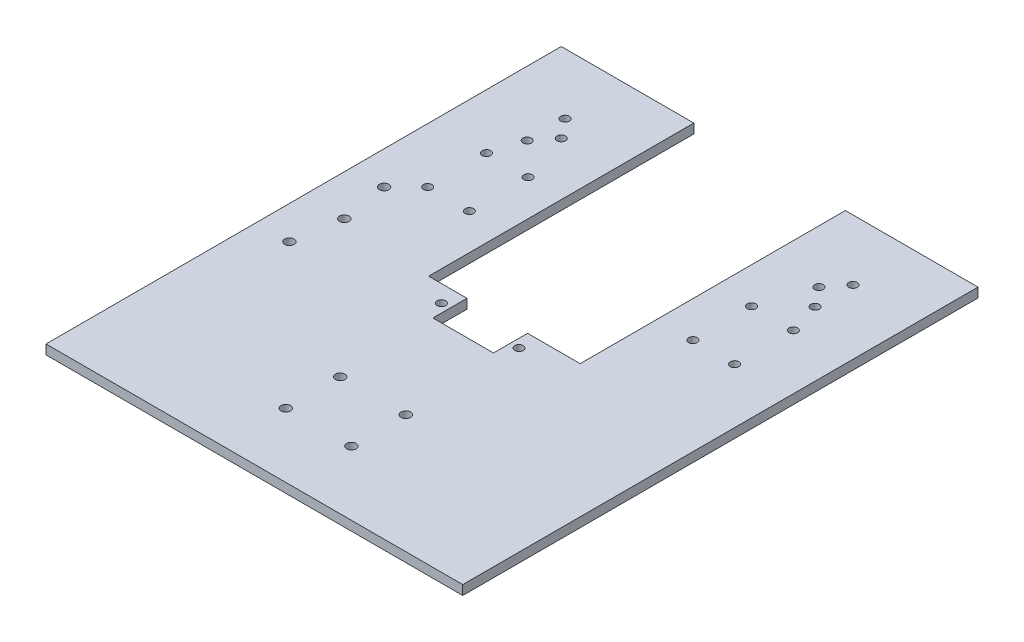
ISO-10303-21;
HEADER;
FILE_DESCRIPTION(('STEP AP214'),'2;1');
FILE_NAME('part.step','',(''),(''),'','','');
FILE_SCHEMA(('AUTOMOTIVE_DESIGN { 1 0 10303 214 1 1 1 1 }'));
ENDSEC;
DATA;
#1=APPLICATION_CONTEXT('core data for automotive mechanical design processes');
#2=APPLICATION_PROTOCOL_DEFINITION('international standard','automotive_design',2000,#1);
#3=PRODUCT_CONTEXT('',#1,'mechanical');
#4=PRODUCT('Part','Part','',(#3));
#5=PRODUCT_RELATED_PRODUCT_CATEGORY('part','',(#4));
#6=PRODUCT_DEFINITION_FORMATION('','',#4);
#7=PRODUCT_DEFINITION_CONTEXT('part definition',#1,'design');
#8=PRODUCT_DEFINITION('design','',#6,#7);
#9=PRODUCT_DEFINITION_SHAPE('','',#8);
#10=(LENGTH_UNIT() NAMED_UNIT(*) SI_UNIT(.MILLI.,.METRE.));
#11=(NAMED_UNIT(*) PLANE_ANGLE_UNIT() SI_UNIT($,.RADIAN.));
#12=(NAMED_UNIT(*) SI_UNIT($,.STERADIAN.) SOLID_ANGLE_UNIT());
#13=UNCERTAINTY_MEASURE_WITH_UNIT(LENGTH_MEASURE(1.E-05),#10,'distance_accuracy_value','');
#14=(GEOMETRIC_REPRESENTATION_CONTEXT(3) GLOBAL_UNCERTAINTY_ASSIGNED_CONTEXT((#13)) GLOBAL_UNIT_ASSIGNED_CONTEXT((#10,
#11,#12)) REPRESENTATION_CONTEXT('',''));
#15=CARTESIAN_POINT('',(0.,0.,0.));
#16=DIRECTION('',(0.,0.,1.));
#17=DIRECTION('',(1.,0.,0.));
#18=AXIS2_PLACEMENT_3D('',#15,#16,#17);
#19=CARTESIAN_POINT('',(0.,5.,0.));
#20=DIRECTION('',(0.,1.,0.));
#21=DIRECTION('',(0.,0.,1.));
#22=AXIS2_PLACEMENT_3D('',#19,#20,#21);
#23=PLANE('',#22);
#24=CARTESIAN_POINT('',(-92.4999999999999,5.,-25.));
#25=DIRECTION('',(0.,1.,0.));
#26=DIRECTION('',(0.,0.,1.));
#27=AXIS2_PLACEMENT_3D('',#24,#25,#26);
#28=CIRCLE('',#27,2.50000000000001);
#29=CARTESIAN_POINT('',(-92.4999999999999,5.,-22.5));
#30=VERTEX_POINT('',#29);
#31=EDGE_CURVE('E218',#30,#30,#28,.T.);
#32=ORIENTED_EDGE('',*,*,#31,.F.);
#33=EDGE_LOOP('',(#32));
#34=FACE_BOUND('',#33,.T.);
#35=CARTESIAN_POINT('',(-17.3151381179272,5.,73.3688551246659));
#36=DIRECTION('',(0.,1.,0.));
#37=DIRECTION('',(0.,0.,1.));
#38=AXIS2_PLACEMENT_3D('',#35,#36,#37);
#39=CIRCLE('',#38,2.5);
#40=CARTESIAN_POINT('',(-17.3151381179272,5.,75.8688551246659));
#41=VERTEX_POINT('',#40);
#42=EDGE_CURVE('E230',#41,#41,#39,.T.);
#43=ORIENTED_EDGE('',*,*,#42,.F.);
#44=EDGE_LOOP('',(#43));
#45=FACE_BOUND('',#44,.T.);
#46=CARTESIAN_POINT('',(17.3151381179272,5.,102.104616256545));
#47=DIRECTION('',(0.,1.,0.));
#48=DIRECTION('',(0.,0.,1.));
#49=AXIS2_PLACEMENT_3D('',#46,#47,#48);
#50=CIRCLE('',#49,2.5);
#51=CARTESIAN_POINT('',(17.3151381179272,5.,104.604616256545));
#52=VERTEX_POINT('',#51);
#53=EDGE_CURVE('E242',#52,#52,#50,.T.);
#54=ORIENTED_EDGE('',*,*,#53,.F.);
#55=EDGE_LOOP('',(#54));
#56=FACE_BOUND('',#55,.T.);
#57=CARTESIAN_POINT('',(-24.2696197225693,5.,13.));
#58=DIRECTION('',(0.,1.,0.));
#59=DIRECTION('',(0.,0.,1.));
#60=AXIS2_PLACEMENT_3D('',#57,#58,#59);
#61=CIRCLE('',#60,2.25000000000001);
#62=CARTESIAN_POINT('',(-24.2696197225693,5.,15.25));
#63=VERTEX_POINT('',#62);
#64=EDGE_CURVE('E275',#63,#63,#61,.T.);
#65=ORIENTED_EDGE('',*,*,#64,.F.);
#66=EDGE_LOOP('',(#65));
#67=FACE_BOUND('',#66,.T.);
#68=CARTESIAN_POINT('',(81.,5.,-67.5));
#69=DIRECTION('',(0.,1.,0.));
#70=DIRECTION('',(0.,0.,1.));
#71=AXIS2_PLACEMENT_3D('',#68,#69,#70);
#72=CIRCLE('',#71,2.25000000000001);
#73=CARTESIAN_POINT('',(81.,5.,-65.25));
#74=VERTEX_POINT('',#73);
#75=EDGE_CURVE('E287',#74,#74,#72,.T.);
#76=ORIENTED_EDGE('',*,*,#75,.F.);
#77=EDGE_LOOP('',(#76));
#78=FACE_BOUND('',#77,.T.);
#79=CARTESIAN_POINT('',(59.,5.,-36.5));
#80=DIRECTION('',(0.,1.,0.));
#81=DIRECTION('',(0.,0.,1.));
#82=AXIS2_PLACEMENT_3D('',#79,#80,#81);
#83=CIRCLE('',#82,2.25);
#84=CARTESIAN_POINT('',(59.,5.,-34.25));
#85=VERTEX_POINT('',#84);
#86=EDGE_CURVE('E299',#85,#85,#83,.T.);
#87=ORIENTED_EDGE('',*,*,#86,.F.);
#88=EDGE_LOOP('',(#87));
#89=FACE_BOUND('',#88,.T.);
#90=CARTESIAN_POINT('',(-59.,5.,-67.5));
#91=DIRECTION('',(0.,1.,0.));
#92=DIRECTION('',(0.,0.,1.));
#93=AXIS2_PLACEMENT_3D('',#90,#91,#92);
#94=CIRCLE('',#93,2.25);
#95=CARTESIAN_POINT('',(-59.,5.,-65.25));
#96=VERTEX_POINT('',#95);
#97=EDGE_CURVE('E311',#96,#96,#94,.T.);
#98=ORIENTED_EDGE('',*,*,#97,.F.);
#99=EDGE_LOOP('',(#98));
#100=FACE_BOUND('',#99,.T.);
#101=CARTESIAN_POINT('',(-81.,5.,-67.5));
#102=DIRECTION('',(0.,1.,0.));
#103=DIRECTION('',(0.,0.,1.));
#104=AXIS2_PLACEMENT_3D('',#101,#102,#103);
#105=CIRCLE('',#104,2.25000000000001);
#106=CARTESIAN_POINT('',(-81.,5.,-65.25));
#107=VERTEX_POINT('',#106);
#108=EDGE_CURVE('E323',#107,#107,#105,.T.);
#109=ORIENTED_EDGE('',*,*,#108,.F.);
#110=EDGE_LOOP('',(#109));
#111=FACE_BOUND('',#110,.T.);
#112=CARTESIAN_POINT('',(-76.,5.,-104.));
#113=DIRECTION('',(0.,1.,0.));
#114=DIRECTION('',(0.,0.,1.));
#115=AXIS2_PLACEMENT_3D('',#112,#113,#114);
#116=CIRCLE('',#115,2.25);
#117=CARTESIAN_POINT('',(-76.,5.,-101.75));
#118=VERTEX_POINT('',#117);
#119=EDGE_CURVE('E335',#118,#118,#116,.T.);
#120=ORIENTED_EDGE('',*,*,#119,.F.);
#121=EDGE_LOOP('',(#120));
#122=FACE_BOUND('',#121,.T.);
#123=CARTESIAN_POINT('',(-68.,5.,-94.));
#124=DIRECTION('',(0.,1.,0.));
#125=DIRECTION('',(0.,0.,1.));
#126=AXIS2_PLACEMENT_3D('',#123,#124,#125);
#127=CIRCLE('',#126,2.25000000000001);
#128=CARTESIAN_POINT('',(-68.,5.,-91.75));
#129=VERTEX_POINT('',#128);
#130=EDGE_CURVE('E347',#129,#129,#127,.T.);
#131=ORIENTED_EDGE('',*,*,#130,.F.);
#132=EDGE_LOOP('',(#131));
#133=FACE_BOUND('',#132,.T.);
#134=CARTESIAN_POINT('',(75.9999999999999,5.,-104.));
#135=DIRECTION('',(0.,1.,0.));
#136=DIRECTION('',(0.,0.,1.));
#137=AXIS2_PLACEMENT_3D('',#134,#135,#136);
#138=CIRCLE('',#137,2.23499999999999);
#139=CARTESIAN_POINT('',(75.9999999999999,5.,-101.765));
#140=VERTEX_POINT('',#139);
#141=EDGE_CURVE('E359',#140,#140,#138,.T.);
#142=ORIENTED_EDGE('',*,*,#141,.F.);
#143=EDGE_LOOP('',(#142));
#144=FACE_BOUND('',#143,.T.);
#145=CARTESIAN_POINT('',(67.9999999999999,5.,-94.));
#146=DIRECTION('',(0.,1.,0.));
#147=DIRECTION('',(0.,0.,1.));
#148=AXIS2_PLACEMENT_3D('',#145,#146,#147);
#149=CIRCLE('',#148,2.25);
#150=CARTESIAN_POINT('',(67.9999999999999,5.,-91.75));
#151=VERTEX_POINT('',#150);
#152=EDGE_CURVE('E363',#151,#151,#149,.T.);
#153=ORIENTED_EDGE('',*,*,#152,.F.);
#154=EDGE_LOOP('',(#153));
#155=FACE_BOUND('',#154,.T.);
#156=CARTESIAN_POINT('',(75.9999999999999,5.,-84.));
#157=DIRECTION('',(0.,1.,0.));
#158=DIRECTION('',(0.,0.,1.));
#159=AXIS2_PLACEMENT_3D('',#156,#157,#158);
#160=CIRCLE('',#159,2.24);
#161=CARTESIAN_POINT('',(75.9999999999999,5.,-81.76));
#162=VERTEX_POINT('',#161);
#163=EDGE_CURVE('E353',#162,#162,#160,.T.);
#164=ORIENTED_EDGE('',*,*,#163,.F.);
#165=EDGE_LOOP('',(#164));
#166=FACE_BOUND('',#165,.T.);
#167=CARTESIAN_POINT('',(-76.,5.,-84.));
#168=DIRECTION('',(0.,1.,0.));
#169=DIRECTION('',(0.,0.,1.));
#170=AXIS2_PLACEMENT_3D('',#167,#168,#169);
#171=CIRCLE('',#170,2.25);
#172=CARTESIAN_POINT('',(-76.,5.,-81.75));
#173=VERTEX_POINT('',#172);
#174=EDGE_CURVE('E341',#173,#173,#171,.T.);
#175=ORIENTED_EDGE('',*,*,#174,.F.);
#176=EDGE_LOOP('',(#175));
#177=FACE_BOUND('',#176,.T.);
#178=CARTESIAN_POINT('',(-17.3151381179272,5.,102.104616256545));
#179=DIRECTION('',(0.,1.,0.));
#180=DIRECTION('',(0.,0.,1.));
#181=AXIS2_PLACEMENT_3D('',#178,#179,#180);
#182=CIRCLE('',#181,2.50000000000001);
#183=CARTESIAN_POINT('',(-17.3151381179272,5.,104.604616256545));
#184=VERTEX_POINT('',#183);
#185=EDGE_CURVE('E329',#184,#184,#182,.T.);
#186=ORIENTED_EDGE('',*,*,#185,.F.);
#187=EDGE_LOOP('',(#186));
#188=FACE_BOUND('',#187,.T.);
#189=CARTESIAN_POINT('',(-81.,5.,-36.5));
#190=DIRECTION('',(0.,1.,0.));
#191=DIRECTION('',(0.,0.,1.));
#192=AXIS2_PLACEMENT_3D('',#189,#190,#191);
#193=CIRCLE('',#192,2.25000000000001);
#194=CARTESIAN_POINT('',(-81.,5.,-34.25));
#195=VERTEX_POINT('',#194);
#196=EDGE_CURVE('E317',#195,#195,#193,.T.);
#197=ORIENTED_EDGE('',*,*,#196,.F.);
#198=EDGE_LOOP('',(#197));
#199=FACE_BOUND('',#198,.T.);
#200=CARTESIAN_POINT('',(-59.,5.,-36.5));
#201=DIRECTION('',(0.,1.,0.));
#202=DIRECTION('',(0.,0.,1.));
#203=AXIS2_PLACEMENT_3D('',#200,#201,#202);
#204=CIRCLE('',#203,2.25);
#205=CARTESIAN_POINT('',(-59.,5.,-34.25));
#206=VERTEX_POINT('',#205);
#207=EDGE_CURVE('E305',#206,#206,#204,.T.);
#208=ORIENTED_EDGE('',*,*,#207,.F.);
#209=EDGE_LOOP('',(#208));
#210=FACE_BOUND('',#209,.T.);
#211=CARTESIAN_POINT('',(59.,5.,-67.5));
#212=DIRECTION('',(0.,1.,0.));
#213=DIRECTION('',(0.,0.,1.));
#214=AXIS2_PLACEMENT_3D('',#211,#212,#213);
#215=CIRCLE('',#214,2.25);
#216=CARTESIAN_POINT('',(59.,5.,-65.25));
#217=VERTEX_POINT('',#216);
#218=EDGE_CURVE('E293',#217,#217,#215,.T.);
#219=ORIENTED_EDGE('',*,*,#218,.F.);
#220=EDGE_LOOP('',(#219));
#221=FACE_BOUND('',#220,.T.);
#222=CARTESIAN_POINT('',(81.,5.,-36.5));
#223=DIRECTION('',(0.,1.,0.));
#224=DIRECTION('',(0.,0.,1.));
#225=AXIS2_PLACEMENT_3D('',#222,#223,#224);
#226=CIRCLE('',#225,2.25);
#227=CARTESIAN_POINT('',(81.,5.,-34.25));
#228=VERTEX_POINT('',#227);
#229=EDGE_CURVE('E281',#228,#228,#226,.T.);
#230=ORIENTED_EDGE('',*,*,#229,.F.);
#231=EDGE_LOOP('',(#230));
#232=FACE_BOUND('',#231,.T.);
#233=CARTESIAN_POINT('',(16.7303802774307,5.,13.));
#234=DIRECTION('',(0.,1.,0.));
#235=DIRECTION('',(0.,0.,1.));
#236=AXIS2_PLACEMENT_3D('',#233,#234,#235);
#237=CIRCLE('',#236,2.24999999999997);
#238=CARTESIAN_POINT('',(16.7303802774307,5.,15.2499999999999));
#239=VERTEX_POINT('',#238);
#240=EDGE_CURVE('E269',#239,#239,#237,.T.);
#241=ORIENTED_EDGE('',*,*,#240,.F.);
#242=EDGE_LOOP('',(#241));
#243=FACE_BOUND('',#242,.T.);
#244=CARTESIAN_POINT('',(17.3151381179272,5.,73.3688551246659));
#245=DIRECTION('',(0.,1.,0.));
#246=DIRECTION('',(0.,0.,1.));
#247=AXIS2_PLACEMENT_3D('',#244,#245,#246);
#248=CIRCLE('',#247,2.49999999999999);
#249=CARTESIAN_POINT('',(17.3151381179272,5.,75.8688551246659));
#250=VERTEX_POINT('',#249);
#251=EDGE_CURVE('E236',#250,#250,#248,.T.);
#252=ORIENTED_EDGE('',*,*,#251,.F.);
#253=EDGE_LOOP('',(#252));
#254=FACE_BOUND('',#253,.T.);
#255=CARTESIAN_POINT('',(-88.4999999999999,5.,0.));
#256=DIRECTION('',(0.,1.,0.));
#257=DIRECTION('',(0.,0.,1.));
#258=AXIS2_PLACEMENT_3D('',#255,#256,#257);
#259=CIRCLE('',#258,2.49999999999999);
#260=CARTESIAN_POINT('',(-88.4999999999999,5.,2.49999999999997));
#261=VERTEX_POINT('',#260);
#262=EDGE_CURVE('E224',#261,#261,#259,.T.);
#263=ORIENTED_EDGE('',*,*,#262,.F.);
#264=EDGE_LOOP('',(#263));
#265=FACE_BOUND('',#264,.T.);
#266=CARTESIAN_POINT('',(-92.4999999999999,5.,25.));
#267=DIRECTION('',(0.,1.,0.));
#268=DIRECTION('',(0.,0.,1.));
#269=AXIS2_PLACEMENT_3D('',#266,#267,#268);
#270=CIRCLE('',#269,2.50000000000001);
#271=CARTESIAN_POINT('',(-92.4999999999999,5.,27.5));
#272=VERTEX_POINT('',#271);
#273=EDGE_CURVE('E212',#272,#272,#270,.T.);
#274=ORIENTED_EDGE('',*,*,#273,.F.);
#275=EDGE_LOOP('',(#274));
#276=FACE_BOUND('',#275,.T.);
#277=DIRECTION('',(-1.,0.,0.));
#278=VECTOR('',#277,1.);
#279=CARTESIAN_POINT('',(-110.,5.,-136.));
#280=LINE('',#279,#278);
#281=CARTESIAN_POINT('',(110.,5.,-136.));
#282=VERTEX_POINT('',#281);
#283=CARTESIAN_POINT('',(40.,5.,-136.));
#284=VERTEX_POINT('',#283);
#285=EDGE_CURVE('E190',#282,#284,#280,.T.);
#286=ORIENTED_EDGE('',*,*,#285,.T.);
#287=DIRECTION('',(0.,0.,1.));
#288=VECTOR('',#287,1.);
#289=CARTESIAN_POINT('',(40.,5.,-136.));
#290=LINE('',#289,#288);
#291=CARTESIAN_POINT('',(40.,5.,3.99999999999995));
#292=VERTEX_POINT('',#291);
#293=EDGE_CURVE('E131',#284,#292,#290,.T.);
#294=ORIENTED_EDGE('',*,*,#293,.T.);
#295=DIRECTION('',(-1.,0.,0.));
#296=VECTOR('',#295,1.);
#297=CARTESIAN_POINT('',(40.,5.,3.99999999999995));
#298=LINE('',#297,#296);
#299=CARTESIAN_POINT('',(12.2303802774307,5.,3.99999999999995));
#300=VERTEX_POINT('',#299);
#301=EDGE_CURVE('E724',#292,#300,#298,.T.);
#302=ORIENTED_EDGE('',*,*,#301,.T.);
#303=DIRECTION('',(0.,0.,-1.));
#304=VECTOR('',#303,1.);
#305=CARTESIAN_POINT('',(12.2303802774307,5.,22.));
#306=LINE('',#305,#304);
#307=CARTESIAN_POINT('',(12.2303802774307,5.,22.));
#308=VERTEX_POINT('',#307);
#309=EDGE_CURVE('E247',#308,#300,#306,.T.);
#310=ORIENTED_EDGE('',*,*,#309,.F.);
#311=DIRECTION('',(1.,0.,0.));
#312=VECTOR('',#311,1.);
#313=CARTESIAN_POINT('',(12.2303802774307,5.,22.));
#314=LINE('',#313,#312);
#315=CARTESIAN_POINT('',(-19.7696197225693,5.,22.));
#316=VERTEX_POINT('',#315);
#317=EDGE_CURVE('E253',#316,#308,#314,.T.);
#318=ORIENTED_EDGE('',*,*,#317,.F.);
#319=DIRECTION('',(0.,0.,1.));
#320=VECTOR('',#319,1.);
#321=CARTESIAN_POINT('',(-19.7696197225693,5.,22.));
#322=LINE('',#321,#320);
#323=CARTESIAN_POINT('',(-19.7696197225693,5.,3.99999999999996));
#324=VERTEX_POINT('',#323);
#325=EDGE_CURVE('E250',#324,#316,#322,.T.);
#326=ORIENTED_EDGE('',*,*,#325,.F.);
#327=CARTESIAN_POINT('',(-40.,5.,3.99999999999996));
#328=VERTEX_POINT('',#327);
#329=EDGE_CURVE('E726',#324,#328,#298,.T.);
#330=ORIENTED_EDGE('',*,*,#329,.T.);
#331=DIRECTION('',(0.,0.,-1.));
#332=VECTOR('',#331,1.);
#333=CARTESIAN_POINT('',(-40.,5.,3.99999999999996));
#334=LINE('',#333,#332);
#335=CARTESIAN_POINT('',(-40.,5.,-136.));
#336=VERTEX_POINT('',#335);
#337=EDGE_CURVE('E145',#328,#336,#334,.T.);
#338=ORIENTED_EDGE('',*,*,#337,.T.);
#339=CARTESIAN_POINT('',(-110.,5.,-136.));
#340=VERTEX_POINT('',#339);
#341=EDGE_CURVE('E188',#336,#340,#280,.T.);
#342=ORIENTED_EDGE('',*,*,#341,.T.);
#343=DIRECTION('',(0.,0.,1.));
#344=VECTOR('',#343,1.);
#345=CARTESIAN_POINT('',(-110.,5.,-136.));
#346=LINE('',#345,#344);
#347=CARTESIAN_POINT('',(-110.,5.,136.));
#348=VERTEX_POINT('',#347);
#349=EDGE_CURVE('E174',#340,#348,#346,.T.);
#350=ORIENTED_EDGE('',*,*,#349,.T.);
#351=DIRECTION('',(1.,0.,0.));
#352=VECTOR('',#351,1.);
#353=CARTESIAN_POINT('',(-110.,5.,136.));
#354=LINE('',#353,#352);
#355=CARTESIAN_POINT('',(110.,5.,136.));
#356=VERTEX_POINT('',#355);
#357=EDGE_CURVE('E165',#348,#356,#354,.T.);
#358=ORIENTED_EDGE('',*,*,#357,.T.);
#359=DIRECTION('',(0.,0.,-1.));
#360=VECTOR('',#359,1.);
#361=CARTESIAN_POINT('',(110.,5.,-136.));
#362=LINE('',#361,#360);
#363=EDGE_CURVE('E160',#356,#282,#362,.T.);
#364=ORIENTED_EDGE('',*,*,#363,.T.);
#365=EDGE_LOOP('',(#286,#294,#302,#310,#318,#326,#330,#338,#342,#350,#358,#364));
#366=FACE_BOUND('',#365,.T.);
#367=ADVANCED_FACE('F35',(#34,#45,#56,#67,#78,#89,#100,#111,#122,#133,#144,#155,#166,#177,#188,
#199,#210,#221,#232,#243,#254,#265,#276,#366),#23,.T.);
#368=CARTESIAN_POINT('',(0.,0.,0.));
#369=DIRECTION('',(0.,1.,0.));
#370=DIRECTION('',(0.,0.,1.));
#371=AXIS2_PLACEMENT_3D('',#368,#369,#370);
#372=PLANE('',#371);
#373=CARTESIAN_POINT('',(-92.4999999999999,0.,25.));
#374=DIRECTION('',(0.,1.,0.));
#375=DIRECTION('',(0.,0.,1.));
#376=AXIS2_PLACEMENT_3D('',#373,#374,#375);
#377=CIRCLE('',#376,2.50000000000001);
#378=CARTESIAN_POINT('',(-92.4999999999999,0.,27.5));
#379=VERTEX_POINT('',#378);
#380=EDGE_CURVE('E135',#379,#379,#377,.T.);
#381=ORIENTED_EDGE('',*,*,#380,.T.);
#382=EDGE_LOOP('',(#381));
#383=FACE_BOUND('',#382,.T.);
#384=CARTESIAN_POINT('',(-92.4999999999999,0.,-25.));
#385=DIRECTION('',(0.,1.,0.));
#386=DIRECTION('',(0.,0.,1.));
#387=AXIS2_PLACEMENT_3D('',#384,#385,#386);
#388=CIRCLE('',#387,2.50000000000001);
#389=CARTESIAN_POINT('',(-92.4999999999999,0.,-22.5));
#390=VERTEX_POINT('',#389);
#391=EDGE_CURVE('E215',#390,#390,#388,.T.);
#392=ORIENTED_EDGE('',*,*,#391,.T.);
#393=EDGE_LOOP('',(#392));
#394=FACE_BOUND('',#393,.T.);
#395=CARTESIAN_POINT('',(-88.4999999999999,0.,0.));
#396=DIRECTION('',(0.,1.,0.));
#397=DIRECTION('',(0.,0.,1.));
#398=AXIS2_PLACEMENT_3D('',#395,#396,#397);
#399=CIRCLE('',#398,2.49999999999999);
#400=CARTESIAN_POINT('',(-88.4999999999999,0.,2.49999999999997));
#401=VERTEX_POINT('',#400);
#402=EDGE_CURVE('E221',#401,#401,#399,.T.);
#403=ORIENTED_EDGE('',*,*,#402,.T.);
#404=EDGE_LOOP('',(#403));
#405=FACE_BOUND('',#404,.T.);
#406=CARTESIAN_POINT('',(-17.3151381179272,0.,73.3688551246659));
#407=DIRECTION('',(0.,1.,0.));
#408=DIRECTION('',(0.,0.,1.));
#409=AXIS2_PLACEMENT_3D('',#406,#407,#408);
#410=CIRCLE('',#409,2.5);
#411=CARTESIAN_POINT('',(-17.3151381179272,0.,75.8688551246659));
#412=VERTEX_POINT('',#411);
#413=EDGE_CURVE('E227',#412,#412,#410,.T.);
#414=ORIENTED_EDGE('',*,*,#413,.T.);
#415=EDGE_LOOP('',(#414));
#416=FACE_BOUND('',#415,.T.);
#417=CARTESIAN_POINT('',(17.3151381179272,0.,73.3688551246659));
#418=DIRECTION('',(0.,1.,0.));
#419=DIRECTION('',(0.,0.,1.));
#420=AXIS2_PLACEMENT_3D('',#417,#418,#419);
#421=CIRCLE('',#420,2.49999999999999);
#422=CARTESIAN_POINT('',(17.3151381179272,0.,75.8688551246659));
#423=VERTEX_POINT('',#422);
#424=EDGE_CURVE('E233',#423,#423,#421,.T.);
#425=ORIENTED_EDGE('',*,*,#424,.T.);
#426=EDGE_LOOP('',(#425));
#427=FACE_BOUND('',#426,.T.);
#428=CARTESIAN_POINT('',(17.3151381179272,0.,102.104616256545));
#429=DIRECTION('',(0.,1.,0.));
#430=DIRECTION('',(0.,0.,1.));
#431=AXIS2_PLACEMENT_3D('',#428,#429,#430);
#432=CIRCLE('',#431,2.5);
#433=CARTESIAN_POINT('',(17.3151381179272,0.,104.604616256545));
#434=VERTEX_POINT('',#433);
#435=EDGE_CURVE('E239',#434,#434,#432,.T.);
#436=ORIENTED_EDGE('',*,*,#435,.T.);
#437=EDGE_LOOP('',(#436));
#438=FACE_BOUND('',#437,.T.);
#439=CARTESIAN_POINT('',(67.9999999999999,0.,-94.));
#440=DIRECTION('',(0.,1.,0.));
#441=DIRECTION('',(0.,0.,1.));
#442=AXIS2_PLACEMENT_3D('',#439,#440,#441);
#443=CIRCLE('',#442,2.25);
#444=CARTESIAN_POINT('',(67.9999999999999,0.,-91.75));
#445=VERTEX_POINT('',#444);
#446=EDGE_CURVE('E193',#445,#445,#443,.T.);
#447=ORIENTED_EDGE('',*,*,#446,.T.);
#448=EDGE_LOOP('',(#447));
#449=FACE_BOUND('',#448,.T.);
#450=CARTESIAN_POINT('',(75.9999999999999,0.,-104.));
#451=DIRECTION('',(0.,1.,0.));
#452=DIRECTION('',(0.,0.,1.));
#453=AXIS2_PLACEMENT_3D('',#450,#451,#452);
#454=CIRCLE('',#453,2.23499999999999);
#455=CARTESIAN_POINT('',(75.9999999999999,0.,-101.765));
#456=VERTEX_POINT('',#455);
#457=EDGE_CURVE('E356',#456,#456,#454,.T.);
#458=ORIENTED_EDGE('',*,*,#457,.T.);
#459=EDGE_LOOP('',(#458));
#460=FACE_BOUND('',#459,.T.);
#461=CARTESIAN_POINT('',(75.9999999999999,0.,-84.));
#462=DIRECTION('',(0.,1.,0.));
#463=DIRECTION('',(0.,0.,1.));
#464=AXIS2_PLACEMENT_3D('',#461,#462,#463);
#465=CIRCLE('',#464,2.24);
#466=CARTESIAN_POINT('',(75.9999999999999,0.,-81.76));
#467=VERTEX_POINT('',#466);
#468=EDGE_CURVE('E350',#467,#467,#465,.T.);
#469=ORIENTED_EDGE('',*,*,#468,.T.);
#470=EDGE_LOOP('',(#469));
#471=FACE_BOUND('',#470,.T.);
#472=CARTESIAN_POINT('',(-68.,0.,-94.));
#473=DIRECTION('',(0.,1.,0.));
#474=DIRECTION('',(0.,0.,1.));
#475=AXIS2_PLACEMENT_3D('',#472,#473,#474);
#476=CIRCLE('',#475,2.25000000000001);
#477=CARTESIAN_POINT('',(-68.,0.,-91.75));
#478=VERTEX_POINT('',#477);
#479=EDGE_CURVE('E344',#478,#478,#476,.T.);
#480=ORIENTED_EDGE('',*,*,#479,.T.);
#481=EDGE_LOOP('',(#480));
#482=FACE_BOUND('',#481,.T.);
#483=CARTESIAN_POINT('',(-76.,0.,-84.));
#484=DIRECTION('',(0.,1.,0.));
#485=DIRECTION('',(0.,0.,1.));
#486=AXIS2_PLACEMENT_3D('',#483,#484,#485);
#487=CIRCLE('',#486,2.25);
#488=CARTESIAN_POINT('',(-76.,0.,-81.75));
#489=VERTEX_POINT('',#488);
#490=EDGE_CURVE('E338',#489,#489,#487,.T.);
#491=ORIENTED_EDGE('',*,*,#490,.T.);
#492=EDGE_LOOP('',(#491));
#493=FACE_BOUND('',#492,.T.);
#494=CARTESIAN_POINT('',(-76.,0.,-104.));
#495=DIRECTION('',(0.,1.,0.));
#496=DIRECTION('',(0.,0.,1.));
#497=AXIS2_PLACEMENT_3D('',#494,#495,#496);
#498=CIRCLE('',#497,2.25);
#499=CARTESIAN_POINT('',(-76.,0.,-101.75));
#500=VERTEX_POINT('',#499);
#501=EDGE_CURVE('E332',#500,#500,#498,.T.);
#502=ORIENTED_EDGE('',*,*,#501,.T.);
#503=EDGE_LOOP('',(#502));
#504=FACE_BOUND('',#503,.T.);
#505=CARTESIAN_POINT('',(-17.3151381179272,0.,102.104616256545));
#506=DIRECTION('',(0.,1.,0.));
#507=DIRECTION('',(0.,0.,1.));
#508=AXIS2_PLACEMENT_3D('',#505,#506,#507);
#509=CIRCLE('',#508,2.50000000000001);
#510=CARTESIAN_POINT('',(-17.3151381179272,0.,104.604616256545));
#511=VERTEX_POINT('',#510);
#512=EDGE_CURVE('E326',#511,#511,#509,.T.);
#513=ORIENTED_EDGE('',*,*,#512,.T.);
#514=EDGE_LOOP('',(#513));
#515=FACE_BOUND('',#514,.T.);
#516=CARTESIAN_POINT('',(-81.,0.,-67.5));
#517=DIRECTION('',(0.,1.,0.));
#518=DIRECTION('',(0.,0.,1.));
#519=AXIS2_PLACEMENT_3D('',#516,#517,#518);
#520=CIRCLE('',#519,2.25000000000001);
#521=CARTESIAN_POINT('',(-81.,0.,-65.25));
#522=VERTEX_POINT('',#521);
#523=EDGE_CURVE('E320',#522,#522,#520,.T.);
#524=ORIENTED_EDGE('',*,*,#523,.T.);
#525=EDGE_LOOP('',(#524));
#526=FACE_BOUND('',#525,.T.);
#527=CARTESIAN_POINT('',(-81.,0.,-36.5));
#528=DIRECTION('',(0.,1.,0.));
#529=DIRECTION('',(0.,0.,1.));
#530=AXIS2_PLACEMENT_3D('',#527,#528,#529);
#531=CIRCLE('',#530,2.25000000000001);
#532=CARTESIAN_POINT('',(-81.,0.,-34.25));
#533=VERTEX_POINT('',#532);
#534=EDGE_CURVE('E314',#533,#533,#531,.T.);
#535=ORIENTED_EDGE('',*,*,#534,.T.);
#536=EDGE_LOOP('',(#535));
#537=FACE_BOUND('',#536,.T.);
#538=CARTESIAN_POINT('',(-59.,0.,-67.5));
#539=DIRECTION('',(0.,1.,0.));
#540=DIRECTION('',(0.,0.,1.));
#541=AXIS2_PLACEMENT_3D('',#538,#539,#540);
#542=CIRCLE('',#541,2.25);
#543=CARTESIAN_POINT('',(-59.,0.,-65.25));
#544=VERTEX_POINT('',#543);
#545=EDGE_CURVE('E308',#544,#544,#542,.T.);
#546=ORIENTED_EDGE('',*,*,#545,.T.);
#547=EDGE_LOOP('',(#546));
#548=FACE_BOUND('',#547,.T.);
#549=CARTESIAN_POINT('',(-59.,0.,-36.5));
#550=DIRECTION('',(0.,1.,0.));
#551=DIRECTION('',(0.,0.,1.));
#552=AXIS2_PLACEMENT_3D('',#549,#550,#551);
#553=CIRCLE('',#552,2.25);
#554=CARTESIAN_POINT('',(-59.,0.,-34.25));
#555=VERTEX_POINT('',#554);
#556=EDGE_CURVE('E302',#555,#555,#553,.T.);
#557=ORIENTED_EDGE('',*,*,#556,.T.);
#558=EDGE_LOOP('',(#557));
#559=FACE_BOUND('',#558,.T.);
#560=CARTESIAN_POINT('',(59.,0.,-36.5));
#561=DIRECTION('',(0.,1.,0.));
#562=DIRECTION('',(0.,0.,1.));
#563=AXIS2_PLACEMENT_3D('',#560,#561,#562);
#564=CIRCLE('',#563,2.25);
#565=CARTESIAN_POINT('',(59.,0.,-34.25));
#566=VERTEX_POINT('',#565);
#567=EDGE_CURVE('E296',#566,#566,#564,.T.);
#568=ORIENTED_EDGE('',*,*,#567,.T.);
#569=EDGE_LOOP('',(#568));
#570=FACE_BOUND('',#569,.T.);
#571=CARTESIAN_POINT('',(59.,0.,-67.5));
#572=DIRECTION('',(0.,1.,0.));
#573=DIRECTION('',(0.,0.,1.));
#574=AXIS2_PLACEMENT_3D('',#571,#572,#573);
#575=CIRCLE('',#574,2.25);
#576=CARTESIAN_POINT('',(59.,0.,-65.25));
#577=VERTEX_POINT('',#576);
#578=EDGE_CURVE('E290',#577,#577,#575,.T.);
#579=ORIENTED_EDGE('',*,*,#578,.T.);
#580=EDGE_LOOP('',(#579));
#581=FACE_BOUND('',#580,.T.);
#582=CARTESIAN_POINT('',(81.,0.,-67.5));
#583=DIRECTION('',(0.,1.,0.));
#584=DIRECTION('',(0.,0.,1.));
#585=AXIS2_PLACEMENT_3D('',#582,#583,#584);
#586=CIRCLE('',#585,2.25000000000001);
#587=CARTESIAN_POINT('',(81.,0.,-65.25));
#588=VERTEX_POINT('',#587);
#589=EDGE_CURVE('E284',#588,#588,#586,.T.);
#590=ORIENTED_EDGE('',*,*,#589,.T.);
#591=EDGE_LOOP('',(#590));
#592=FACE_BOUND('',#591,.T.);
#593=CARTESIAN_POINT('',(81.,0.,-36.5));
#594=DIRECTION('',(0.,1.,0.));
#595=DIRECTION('',(0.,0.,1.));
#596=AXIS2_PLACEMENT_3D('',#593,#594,#595);
#597=CIRCLE('',#596,2.25);
#598=CARTESIAN_POINT('',(81.,0.,-34.25));
#599=VERTEX_POINT('',#598);
#600=EDGE_CURVE('E278',#599,#599,#597,.T.);
#601=ORIENTED_EDGE('',*,*,#600,.T.);
#602=EDGE_LOOP('',(#601));
#603=FACE_BOUND('',#602,.T.);
#604=CARTESIAN_POINT('',(-24.2696197225693,0.,13.));
#605=DIRECTION('',(0.,1.,0.));
#606=DIRECTION('',(0.,0.,1.));
#607=AXIS2_PLACEMENT_3D('',#604,#605,#606);
#608=CIRCLE('',#607,2.25000000000001);
#609=CARTESIAN_POINT('',(-24.2696197225693,0.,15.25));
#610=VERTEX_POINT('',#609);
#611=EDGE_CURVE('E272',#610,#610,#608,.T.);
#612=ORIENTED_EDGE('',*,*,#611,.T.);
#613=EDGE_LOOP('',(#612));
#614=FACE_BOUND('',#613,.T.);
#615=CARTESIAN_POINT('',(16.7303802774307,0.,13.));
#616=DIRECTION('',(0.,1.,0.));
#617=DIRECTION('',(0.,0.,1.));
#618=AXIS2_PLACEMENT_3D('',#615,#616,#617);
#619=CIRCLE('',#618,2.24999999999997);
#620=CARTESIAN_POINT('',(16.7303802774307,0.,15.2499999999999));
#621=VERTEX_POINT('',#620);
#622=EDGE_CURVE('E268',#621,#621,#619,.T.);
#623=ORIENTED_EDGE('',*,*,#622,.T.);
#624=EDGE_LOOP('',(#623));
#625=FACE_BOUND('',#624,.T.);
#626=DIRECTION('',(0.,0.,1.));
#627=VECTOR('',#626,1.);
#628=CARTESIAN_POINT('',(40.,0.,-136.));
#629=LINE('',#628,#627);
#630=CARTESIAN_POINT('',(40.,0.,-136.));
#631=VERTEX_POINT('',#630);
#632=CARTESIAN_POINT('',(40.,0.,3.99999999999995));
#633=VERTEX_POINT('',#632);
#634=EDGE_CURVE('E128',#631,#633,#629,.T.);
#635=ORIENTED_EDGE('',*,*,#634,.F.);
#636=DIRECTION('',(-1.,0.,0.));
#637=VECTOR('',#636,1.);
#638=CARTESIAN_POINT('',(-110.,0.,-136.));
#639=LINE('',#638,#637);
#640=CARTESIAN_POINT('',(110.,0.,-136.));
#641=VERTEX_POINT('',#640);
#642=EDGE_CURVE('E142',#641,#631,#639,.T.);
#643=ORIENTED_EDGE('',*,*,#642,.F.);
#644=DIRECTION('',(0.,0.,-1.));
#645=VECTOR('',#644,1.);
#646=CARTESIAN_POINT('',(110.,0.,-136.));
#647=LINE('',#646,#645);
#648=CARTESIAN_POINT('',(110.,0.,136.));
#649=VERTEX_POINT('',#648);
#650=EDGE_CURVE('E155',#649,#641,#647,.T.);
#651=ORIENTED_EDGE('',*,*,#650,.F.);
#652=DIRECTION('',(1.,0.,0.));
#653=VECTOR('',#652,1.);
#654=CARTESIAN_POINT('',(-110.,0.,136.));
#655=LINE('',#654,#653);
#656=CARTESIAN_POINT('',(-110.,0.,136.));
#657=VERTEX_POINT('',#656);
#658=EDGE_CURVE('E153',#657,#649,#655,.T.);
#659=ORIENTED_EDGE('',*,*,#658,.F.);
#660=DIRECTION('',(0.,0.,1.));
#661=VECTOR('',#660,1.);
#662=CARTESIAN_POINT('',(-110.,0.,-136.));
#663=LINE('',#662,#661);
#664=CARTESIAN_POINT('',(-110.,0.,-136.));
#665=VERTEX_POINT('',#664);
#666=EDGE_CURVE('E150',#665,#657,#663,.T.);
#667=ORIENTED_EDGE('',*,*,#666,.F.);
#668=CARTESIAN_POINT('',(-40.,0.,-136.));
#669=VERTEX_POINT('',#668);
#670=EDGE_CURVE('E151',#669,#665,#639,.T.);
#671=ORIENTED_EDGE('',*,*,#670,.F.);
#672=DIRECTION('',(0.,0.,-1.));
#673=VECTOR('',#672,1.);
#674=CARTESIAN_POINT('',(-40.,0.,3.99999999999996));
#675=LINE('',#674,#673);
#676=CARTESIAN_POINT('',(-40.,0.,3.99999999999996));
#677=VERTEX_POINT('',#676);
#678=EDGE_CURVE('E204',#677,#669,#675,.T.);
#679=ORIENTED_EDGE('',*,*,#678,.F.);
#680=DIRECTION('',(-1.,0.,0.));
#681=VECTOR('',#680,1.);
#682=CARTESIAN_POINT('',(40.,0.,3.99999999999995));
#683=LINE('',#682,#681);
#684=CARTESIAN_POINT('',(-19.7696197225693,0.,3.99999999999995));
#685=VERTEX_POINT('',#684);
#686=EDGE_CURVE('E144',#685,#677,#683,.T.);
#687=ORIENTED_EDGE('',*,*,#686,.F.);
#688=DIRECTION('',(0.,0.,1.));
#689=VECTOR('',#688,1.);
#690=CARTESIAN_POINT('',(-19.7696197225693,0.,22.));
#691=LINE('',#690,#689);
#692=CARTESIAN_POINT('',(-19.7696197225693,0.,22.));
#693=VERTEX_POINT('',#692);
#694=EDGE_CURVE('E257',#685,#693,#691,.T.);
#695=ORIENTED_EDGE('',*,*,#694,.T.);
#696=DIRECTION('',(1.,0.,0.));
#697=VECTOR('',#696,1.);
#698=CARTESIAN_POINT('',(12.2303802774307,0.,22.));
#699=LINE('',#698,#697);
#700=CARTESIAN_POINT('',(12.2303802774307,0.,22.));
#701=VERTEX_POINT('',#700);
#702=EDGE_CURVE('E251',#693,#701,#699,.T.);
#703=ORIENTED_EDGE('',*,*,#702,.T.);
#704=DIRECTION('',(0.,0.,-1.));
#705=VECTOR('',#704,1.);
#706=CARTESIAN_POINT('',(12.2303802774307,0.,22.));
#707=LINE('',#706,#705);
#708=CARTESIAN_POINT('',(12.2303802774307,0.,3.99999999999996));
#709=VERTEX_POINT('',#708);
#710=EDGE_CURVE('E58',#701,#709,#707,.T.);
#711=ORIENTED_EDGE('',*,*,#710,.T.);
#712=EDGE_CURVE('E143',#633,#709,#683,.T.);
#713=ORIENTED_EDGE('',*,*,#712,.F.);
#714=EDGE_LOOP('',(#635,#643,#651,#659,#667,#671,#679,#687,#695,#703,#711,#713));
#715=FACE_BOUND('',#714,.T.);
#716=ADVANCED_FACE('F140',(#383,#394,#405,#416,#427,#438,#449,#460,#471,#482,#493,#504,#515,
#526,#537,#548,#559,#570,#581,#592,#603,#614,#625,#715),#372,.F.);
#717=CARTESIAN_POINT('',(-110.,5.,-136.));
#718=DIRECTION('',(0.,0.,1.));
#719=DIRECTION('',(1.,0.,0.));
#720=AXIS2_PLACEMENT_3D('',#717,#718,#719);
#721=PLANE('',#720);
#722=DIRECTION('',(0.,1.,0.));
#723=VECTOR('',#722,1.);
#724=CARTESIAN_POINT('',(40.,0.,-136.));
#725=LINE('',#724,#723);
#726=EDGE_CURVE('E125',#631,#284,#725,.T.);
#727=ORIENTED_EDGE('',*,*,#726,.T.);
#728=ORIENTED_EDGE('',*,*,#285,.F.);
#729=DIRECTION('',(0.,-1.,0.));
#730=VECTOR('',#729,1.);
#731=CARTESIAN_POINT('',(110.,5.,-136.));
#732=LINE('',#731,#730);
#733=EDGE_CURVE('E11',#282,#641,#732,.T.);
#734=ORIENTED_EDGE('',*,*,#733,.T.);
#735=ORIENTED_EDGE('',*,*,#642,.T.);
#736=EDGE_LOOP('',(#727,#728,#734,#735));
#737=FACE_BOUND('',#736,.T.);
#738=ADVANCED_FACE('F147',(#737),#721,.F.);
#739=DIRECTION('',(0.,1.,0.));
#740=VECTOR('',#739,1.);
#741=CARTESIAN_POINT('',(-40.,0.,-136.));
#742=LINE('',#741,#740);
#743=EDGE_CURVE('E201',#669,#336,#742,.T.);
#744=ORIENTED_EDGE('',*,*,#743,.F.);
#745=ORIENTED_EDGE('',*,*,#670,.T.);
#746=DIRECTION('',(0.,-1.,0.));
#747=VECTOR('',#746,1.);
#748=CARTESIAN_POINT('',(-110.,5.,-136.));
#749=LINE('',#748,#747);
#750=EDGE_CURVE('E43',#340,#665,#749,.T.);
#751=ORIENTED_EDGE('',*,*,#750,.F.);
#752=ORIENTED_EDGE('',*,*,#341,.F.);
#753=EDGE_LOOP('',(#744,#745,#751,#752));
#754=FACE_BOUND('',#753,.T.);
#755=ADVANCED_FACE('F200',(#754),#721,.F.);
#756=CARTESIAN_POINT('',(110.,5.,-136.));
#757=DIRECTION('',(-1.,0.,0.));
#758=DIRECTION('',(0.,0.,1.));
#759=AXIS2_PLACEMENT_3D('',#756,#757,#758);
#760=PLANE('',#759);
#761=ORIENTED_EDGE('',*,*,#650,.T.);
#762=ORIENTED_EDGE('',*,*,#733,.F.);
#763=ORIENTED_EDGE('',*,*,#363,.F.);
#764=DIRECTION('',(0.,-1.,0.));
#765=VECTOR('',#764,1.);
#766=CARTESIAN_POINT('',(110.,5.,136.));
#767=LINE('',#766,#765);
#768=EDGE_CURVE('E161',#356,#649,#767,.T.);
#769=ORIENTED_EDGE('',*,*,#768,.T.);
#770=EDGE_LOOP('',(#761,#762,#763,#769));
#771=FACE_BOUND('',#770,.T.);
#772=ADVANCED_FACE('F37',(#771),#760,.F.);
#773=CARTESIAN_POINT('',(-110.,5.,-136.));
#774=DIRECTION('',(1.,0.,0.));
#775=DIRECTION('',(0.,0.,-1.));
#776=AXIS2_PLACEMENT_3D('',#773,#774,#775);
#777=PLANE('',#776);
#778=ORIENTED_EDGE('',*,*,#666,.T.);
#779=DIRECTION('',(0.,-1.,0.));
#780=VECTOR('',#779,1.);
#781=CARTESIAN_POINT('',(-110.,5.,136.));
#782=LINE('',#781,#780);
#783=EDGE_CURVE('E164',#348,#657,#782,.T.);
#784=ORIENTED_EDGE('',*,*,#783,.F.);
#785=ORIENTED_EDGE('',*,*,#349,.F.);
#786=ORIENTED_EDGE('',*,*,#750,.T.);
#787=EDGE_LOOP('',(#778,#784,#785,#786));
#788=FACE_BOUND('',#787,.T.);
#789=ADVANCED_FACE('F172',(#788),#777,.F.);
#790=CARTESIAN_POINT('',(-110.,5.,136.));
#791=DIRECTION('',(0.,0.,-1.));
#792=DIRECTION('',(-1.,0.,0.));
#793=AXIS2_PLACEMENT_3D('',#790,#791,#792);
#794=PLANE('',#793);
#795=ORIENTED_EDGE('',*,*,#658,.T.);
#796=ORIENTED_EDGE('',*,*,#768,.F.);
#797=ORIENTED_EDGE('',*,*,#357,.F.);
#798=ORIENTED_EDGE('',*,*,#783,.T.);
#799=EDGE_LOOP('',(#795,#796,#797,#798));
#800=FACE_BOUND('',#799,.T.);
#801=ADVANCED_FACE('F182',(#800),#794,.F.);
#802=CARTESIAN_POINT('',(67.9999999999999,5.,-94.));
#803=DIRECTION('',(0.,-1.,0.));
#804=DIRECTION('',(0.,0.,-1.));
#805=AXIS2_PLACEMENT_3D('',#802,#803,#804);
#806=CYLINDRICAL_SURFACE('',#805,2.25);
#807=ORIENTED_EDGE('',*,*,#152,.T.);
#808=EDGE_LOOP('',(#807));
#809=FACE_BOUND('',#808,.T.);
#810=ORIENTED_EDGE('',*,*,#446,.F.);
#811=EDGE_LOOP('',(#810));
#812=FACE_BOUND('',#811,.T.);
#813=ADVANCED_FACE('F372',(#809,#812),#806,.F.);
#814=CARTESIAN_POINT('',(75.9999999999999,5.,-104.));
#815=DIRECTION('',(0.,-1.,0.));
#816=DIRECTION('',(0.,0.,-1.));
#817=AXIS2_PLACEMENT_3D('',#814,#815,#816);
#818=CYLINDRICAL_SURFACE('',#817,2.23499999999999);
#819=ORIENTED_EDGE('',*,*,#141,.T.);
#820=EDGE_LOOP('',(#819));
#821=FACE_BOUND('',#820,.T.);
#822=ORIENTED_EDGE('',*,*,#457,.F.);
#823=EDGE_LOOP('',(#822));
#824=FACE_BOUND('',#823,.T.);
#825=ADVANCED_FACE('F374',(#821,#824),#818,.F.);
#826=CARTESIAN_POINT('',(75.9999999999999,5.,-84.));
#827=DIRECTION('',(0.,-1.,0.));
#828=DIRECTION('',(0.,0.,-1.));
#829=AXIS2_PLACEMENT_3D('',#826,#827,#828);
#830=CYLINDRICAL_SURFACE('',#829,2.24);
#831=ORIENTED_EDGE('',*,*,#163,.T.);
#832=EDGE_LOOP('',(#831));
#833=FACE_BOUND('',#832,.T.);
#834=ORIENTED_EDGE('',*,*,#468,.F.);
#835=EDGE_LOOP('',(#834));
#836=FACE_BOUND('',#835,.T.);
#837=ADVANCED_FACE('F380',(#833,#836),#830,.F.);
#838=CARTESIAN_POINT('',(-68.,5.,-94.));
#839=DIRECTION('',(0.,-1.,0.));
#840=DIRECTION('',(0.,0.,-1.));
#841=AXIS2_PLACEMENT_3D('',#838,#839,#840);
#842=CYLINDRICAL_SURFACE('',#841,2.25000000000001);
#843=ORIENTED_EDGE('',*,*,#130,.T.);
#844=EDGE_LOOP('',(#843));
#845=FACE_BOUND('',#844,.T.);
#846=ORIENTED_EDGE('',*,*,#479,.F.);
#847=EDGE_LOOP('',(#846));
#848=FACE_BOUND('',#847,.T.);
#849=ADVANCED_FACE('F432',(#845,#848),#842,.F.);
#850=CARTESIAN_POINT('',(-76.,5.,-84.));
#851=DIRECTION('',(0.,-1.,0.));
#852=DIRECTION('',(0.,0.,-1.));
#853=AXIS2_PLACEMENT_3D('',#850,#851,#852);
#854=CYLINDRICAL_SURFACE('',#853,2.25);
#855=ORIENTED_EDGE('',*,*,#174,.T.);
#856=EDGE_LOOP('',(#855));
#857=FACE_BOUND('',#856,.T.);
#858=ORIENTED_EDGE('',*,*,#490,.F.);
#859=EDGE_LOOP('',(#858));
#860=FACE_BOUND('',#859,.T.);
#861=ADVANCED_FACE('F442',(#857,#860),#854,.F.);
#862=CARTESIAN_POINT('',(-76.,5.,-104.));
#863=DIRECTION('',(0.,-1.,0.));
#864=DIRECTION('',(0.,0.,-1.));
#865=AXIS2_PLACEMENT_3D('',#862,#863,#864);
#866=CYLINDRICAL_SURFACE('',#865,2.25);
#867=ORIENTED_EDGE('',*,*,#119,.T.);
#868=EDGE_LOOP('',(#867));
#869=FACE_BOUND('',#868,.T.);
#870=ORIENTED_EDGE('',*,*,#501,.F.);
#871=EDGE_LOOP('',(#870));
#872=FACE_BOUND('',#871,.T.);
#873=ADVANCED_FACE('F452',(#869,#872),#866,.F.);
#874=CARTESIAN_POINT('',(-17.3151381179272,5.,102.104616256545));
#875=DIRECTION('',(0.,-1.,0.));
#876=DIRECTION('',(0.,0.,-1.));
#877=AXIS2_PLACEMENT_3D('',#874,#875,#876);
#878=CYLINDRICAL_SURFACE('',#877,2.50000000000001);
#879=ORIENTED_EDGE('',*,*,#185,.T.);
#880=EDGE_LOOP('',(#879));
#881=FACE_BOUND('',#880,.T.);
#882=ORIENTED_EDGE('',*,*,#512,.F.);
#883=EDGE_LOOP('',(#882));
#884=FACE_BOUND('',#883,.T.);
#885=ADVANCED_FACE('F462',(#881,#884),#878,.F.);
#886=CARTESIAN_POINT('',(-81.,5.,-67.5));
#887=DIRECTION('',(0.,-1.,0.));
#888=DIRECTION('',(0.,0.,-1.));
#889=AXIS2_PLACEMENT_3D('',#886,#887,#888);
#890=CYLINDRICAL_SURFACE('',#889,2.25000000000001);
#891=ORIENTED_EDGE('',*,*,#108,.T.);
#892=EDGE_LOOP('',(#891));
#893=FACE_BOUND('',#892,.T.);
#894=ORIENTED_EDGE('',*,*,#523,.F.);
#895=EDGE_LOOP('',(#894));
#896=FACE_BOUND('',#895,.T.);
#897=ADVANCED_FACE('F472',(#893,#896),#890,.F.);
#898=CARTESIAN_POINT('',(-81.,5.,-36.5));
#899=DIRECTION('',(0.,-1.,0.));
#900=DIRECTION('',(0.,0.,-1.));
#901=AXIS2_PLACEMENT_3D('',#898,#899,#900);
#902=CYLINDRICAL_SURFACE('',#901,2.25000000000001);
#903=ORIENTED_EDGE('',*,*,#196,.T.);
#904=EDGE_LOOP('',(#903));
#905=FACE_BOUND('',#904,.T.);
#906=ORIENTED_EDGE('',*,*,#534,.F.);
#907=EDGE_LOOP('',(#906));
#908=FACE_BOUND('',#907,.T.);
#909=ADVANCED_FACE('F482',(#905,#908),#902,.F.);
#910=CARTESIAN_POINT('',(-59.,5.,-67.5));
#911=DIRECTION('',(0.,-1.,0.));
#912=DIRECTION('',(0.,0.,-1.));
#913=AXIS2_PLACEMENT_3D('',#910,#911,#912);
#914=CYLINDRICAL_SURFACE('',#913,2.25);
#915=ORIENTED_EDGE('',*,*,#97,.T.);
#916=EDGE_LOOP('',(#915));
#917=FACE_BOUND('',#916,.T.);
#918=ORIENTED_EDGE('',*,*,#545,.F.);
#919=EDGE_LOOP('',(#918));
#920=FACE_BOUND('',#919,.T.);
#921=ADVANCED_FACE('F492',(#917,#920),#914,.F.);
#922=CARTESIAN_POINT('',(-59.,5.,-36.5));
#923=DIRECTION('',(0.,-1.,0.));
#924=DIRECTION('',(0.,0.,-1.));
#925=AXIS2_PLACEMENT_3D('',#922,#923,#924);
#926=CYLINDRICAL_SURFACE('',#925,2.25);
#927=ORIENTED_EDGE('',*,*,#207,.T.);
#928=EDGE_LOOP('',(#927));
#929=FACE_BOUND('',#928,.T.);
#930=ORIENTED_EDGE('',*,*,#556,.F.);
#931=EDGE_LOOP('',(#930));
#932=FACE_BOUND('',#931,.T.);
#933=ADVANCED_FACE('F502',(#929,#932),#926,.F.);
#934=CARTESIAN_POINT('',(59.,5.,-36.5));
#935=DIRECTION('',(0.,-1.,0.));
#936=DIRECTION('',(0.,0.,-1.));
#937=AXIS2_PLACEMENT_3D('',#934,#935,#936);
#938=CYLINDRICAL_SURFACE('',#937,2.25);
#939=ORIENTED_EDGE('',*,*,#86,.T.);
#940=EDGE_LOOP('',(#939));
#941=FACE_BOUND('',#940,.T.);
#942=ORIENTED_EDGE('',*,*,#567,.F.);
#943=EDGE_LOOP('',(#942));
#944=FACE_BOUND('',#943,.T.);
#945=ADVANCED_FACE('F512',(#941,#944),#938,.F.);
#946=CARTESIAN_POINT('',(59.,5.,-67.5));
#947=DIRECTION('',(0.,-1.,0.));
#948=DIRECTION('',(0.,0.,-1.));
#949=AXIS2_PLACEMENT_3D('',#946,#947,#948);
#950=CYLINDRICAL_SURFACE('',#949,2.25);
#951=ORIENTED_EDGE('',*,*,#218,.T.);
#952=EDGE_LOOP('',(#951));
#953=FACE_BOUND('',#952,.T.);
#954=ORIENTED_EDGE('',*,*,#578,.F.);
#955=EDGE_LOOP('',(#954));
#956=FACE_BOUND('',#955,.T.);
#957=ADVANCED_FACE('F522',(#953,#956),#950,.F.);
#958=CARTESIAN_POINT('',(81.,5.,-67.5));
#959=DIRECTION('',(0.,-1.,0.));
#960=DIRECTION('',(0.,0.,-1.));
#961=AXIS2_PLACEMENT_3D('',#958,#959,#960);
#962=CYLINDRICAL_SURFACE('',#961,2.25000000000001);
#963=ORIENTED_EDGE('',*,*,#75,.T.);
#964=EDGE_LOOP('',(#963));
#965=FACE_BOUND('',#964,.T.);
#966=ORIENTED_EDGE('',*,*,#589,.F.);
#967=EDGE_LOOP('',(#966));
#968=FACE_BOUND('',#967,.T.);
#969=ADVANCED_FACE('F532',(#965,#968),#962,.F.);
#970=CARTESIAN_POINT('',(81.,5.,-36.5));
#971=DIRECTION('',(0.,-1.,0.));
#972=DIRECTION('',(0.,0.,-1.));
#973=AXIS2_PLACEMENT_3D('',#970,#971,#972);
#974=CYLINDRICAL_SURFACE('',#973,2.25);
#975=ORIENTED_EDGE('',*,*,#229,.T.);
#976=EDGE_LOOP('',(#975));
#977=FACE_BOUND('',#976,.T.);
#978=ORIENTED_EDGE('',*,*,#600,.F.);
#979=EDGE_LOOP('',(#978));
#980=FACE_BOUND('',#979,.T.);
#981=ADVANCED_FACE('F542',(#977,#980),#974,.F.);
#982=CARTESIAN_POINT('',(-24.2696197225693,5.,13.));
#983=DIRECTION('',(0.,-1.,0.));
#984=DIRECTION('',(0.,0.,-1.));
#985=AXIS2_PLACEMENT_3D('',#982,#983,#984);
#986=CYLINDRICAL_SURFACE('',#985,2.25000000000001);
#987=ORIENTED_EDGE('',*,*,#64,.T.);
#988=EDGE_LOOP('',(#987));
#989=FACE_BOUND('',#988,.T.);
#990=ORIENTED_EDGE('',*,*,#611,.F.);
#991=EDGE_LOOP('',(#990));
#992=FACE_BOUND('',#991,.T.);
#993=ADVANCED_FACE('F552',(#989,#992),#986,.F.);
#994=CARTESIAN_POINT('',(16.7303802774307,5.,13.));
#995=DIRECTION('',(0.,-1.,0.));
#996=DIRECTION('',(0.,0.,-1.));
#997=AXIS2_PLACEMENT_3D('',#994,#995,#996);
#998=CYLINDRICAL_SURFACE('',#997,2.24999999999997);
#999=ORIENTED_EDGE('',*,*,#240,.T.);
#1000=EDGE_LOOP('',(#999));
#1001=FACE_BOUND('',#1000,.T.);
#1002=ORIENTED_EDGE('',*,*,#622,.F.);
#1003=EDGE_LOOP('',(#1002));
#1004=FACE_BOUND('',#1003,.T.);
#1005=ADVANCED_FACE('F562',(#1001,#1004),#998,.F.);
#1006=CARTESIAN_POINT('',(12.2303802774307,5.,22.));
#1007=DIRECTION('',(-1.,0.,0.));
#1008=DIRECTION('',(0.,0.,1.));
#1009=AXIS2_PLACEMENT_3D('',#1006,#1007,#1008);
#1010=PLANE('',#1009);
#1011=ORIENTED_EDGE('',*,*,#710,.F.);
#1012=DIRECTION('',(0.,-1.,0.));
#1013=VECTOR('',#1012,1.);
#1014=CARTESIAN_POINT('',(12.2303802774307,5.,22.));
#1015=LINE('',#1014,#1013);
#1016=EDGE_CURVE('E255',#308,#701,#1015,.T.);
#1017=ORIENTED_EDGE('',*,*,#1016,.F.);
#1018=ORIENTED_EDGE('',*,*,#309,.T.);
#1019=DIRECTION('',(0.,-1.,0.));
#1020=VECTOR('',#1019,1.);
#1021=CARTESIAN_POINT('',(12.2303802774307,5.,3.99999999999996));
#1022=LINE('',#1021,#1020);
#1023=EDGE_CURVE('E266',#300,#709,#1022,.T.);
#1024=ORIENTED_EDGE('',*,*,#1023,.T.);
#1025=EDGE_LOOP('',(#1011,#1017,#1018,#1024));
#1026=FACE_BOUND('',#1025,.T.);
#1027=ADVANCED_FACE('F572',(#1026),#1010,.T.);
#1028=CARTESIAN_POINT('',(-19.7696197225693,5.,22.));
#1029=DIRECTION('',(1.,0.,0.));
#1030=DIRECTION('',(0.,0.,-1.));
#1031=AXIS2_PLACEMENT_3D('',#1028,#1029,#1030);
#1032=PLANE('',#1031);
#1033=ORIENTED_EDGE('',*,*,#694,.F.);
#1034=DIRECTION('',(0.,-1.,0.));
#1035=VECTOR('',#1034,1.);
#1036=CARTESIAN_POINT('',(-19.7696197225693,5.,3.99999999999996));
#1037=LINE('',#1036,#1035);
#1038=EDGE_CURVE('E264',#324,#685,#1037,.T.);
#1039=ORIENTED_EDGE('',*,*,#1038,.F.);
#1040=ORIENTED_EDGE('',*,*,#325,.T.);
#1041=DIRECTION('',(0.,-1.,0.));
#1042=VECTOR('',#1041,1.);
#1043=CARTESIAN_POINT('',(-19.7696197225693,5.,22.));
#1044=LINE('',#1043,#1042);
#1045=EDGE_CURVE('E50',#316,#693,#1044,.T.);
#1046=ORIENTED_EDGE('',*,*,#1045,.T.);
#1047=EDGE_LOOP('',(#1033,#1039,#1040,#1046));
#1048=FACE_BOUND('',#1047,.T.);
#1049=ADVANCED_FACE('F586',(#1048),#1032,.T.);
#1050=CARTESIAN_POINT('',(12.2303802774307,5.,22.));
#1051=DIRECTION('',(0.,0.,-1.));
#1052=DIRECTION('',(-1.,0.,0.));
#1053=AXIS2_PLACEMENT_3D('',#1050,#1051,#1052);
#1054=PLANE('',#1053);
#1055=ORIENTED_EDGE('',*,*,#702,.F.);
#1056=ORIENTED_EDGE('',*,*,#1045,.F.);
#1057=ORIENTED_EDGE('',*,*,#317,.T.);
#1058=ORIENTED_EDGE('',*,*,#1016,.T.);
#1059=EDGE_LOOP('',(#1055,#1056,#1057,#1058));
#1060=FACE_BOUND('',#1059,.T.);
#1061=ADVANCED_FACE('F580',(#1060),#1054,.T.);
#1062=CARTESIAN_POINT('',(17.3151381179272,5.,102.104616256545));
#1063=DIRECTION('',(0.,-1.,0.));
#1064=DIRECTION('',(0.,0.,-1.));
#1065=AXIS2_PLACEMENT_3D('',#1062,#1063,#1064);
#1066=CYLINDRICAL_SURFACE('',#1065,2.5);
#1067=ORIENTED_EDGE('',*,*,#53,.T.);
#1068=EDGE_LOOP('',(#1067));
#1069=FACE_BOUND('',#1068,.T.);
#1070=ORIENTED_EDGE('',*,*,#435,.F.);
#1071=EDGE_LOOP('',(#1070));
#1072=FACE_BOUND('',#1071,.T.);
#1073=ADVANCED_FACE('F585',(#1069,#1072),#1066,.F.);
#1074=CARTESIAN_POINT('',(17.3151381179272,5.,73.3688551246659));
#1075=DIRECTION('',(0.,-1.,0.));
#1076=DIRECTION('',(0.,0.,-1.));
#1077=AXIS2_PLACEMENT_3D('',#1074,#1075,#1076);
#1078=CYLINDRICAL_SURFACE('',#1077,2.49999999999999);
#1079=ORIENTED_EDGE('',*,*,#251,.T.);
#1080=EDGE_LOOP('',(#1079));
#1081=FACE_BOUND('',#1080,.T.);
#1082=ORIENTED_EDGE('',*,*,#424,.F.);
#1083=EDGE_LOOP('',(#1082));
#1084=FACE_BOUND('',#1083,.T.);
#1085=ADVANCED_FACE('F597',(#1081,#1084),#1078,.F.);
#1086=CARTESIAN_POINT('',(-17.3151381179272,5.,73.3688551246659));
#1087=DIRECTION('',(0.,-1.,0.));
#1088=DIRECTION('',(0.,0.,-1.));
#1089=AXIS2_PLACEMENT_3D('',#1086,#1087,#1088);
#1090=CYLINDRICAL_SURFACE('',#1089,2.5);
#1091=ORIENTED_EDGE('',*,*,#42,.T.);
#1092=EDGE_LOOP('',(#1091));
#1093=FACE_BOUND('',#1092,.T.);
#1094=ORIENTED_EDGE('',*,*,#413,.F.);
#1095=EDGE_LOOP('',(#1094));
#1096=FACE_BOUND('',#1095,.T.);
#1097=ADVANCED_FACE('F607',(#1093,#1096),#1090,.F.);
#1098=CARTESIAN_POINT('',(-88.4999999999999,5.,0.));
#1099=DIRECTION('',(0.,-1.,0.));
#1100=DIRECTION('',(0.,0.,-1.));
#1101=AXIS2_PLACEMENT_3D('',#1098,#1099,#1100);
#1102=CYLINDRICAL_SURFACE('',#1101,2.49999999999999);
#1103=ORIENTED_EDGE('',*,*,#262,.T.);
#1104=EDGE_LOOP('',(#1103));
#1105=FACE_BOUND('',#1104,.T.);
#1106=ORIENTED_EDGE('',*,*,#402,.F.);
#1107=EDGE_LOOP('',(#1106));
#1108=FACE_BOUND('',#1107,.T.);
#1109=ADVANCED_FACE('F617',(#1105,#1108),#1102,.F.);
#1110=CARTESIAN_POINT('',(-92.4999999999999,5.,-25.));
#1111=DIRECTION('',(0.,-1.,0.));
#1112=DIRECTION('',(0.,0.,-1.));
#1113=AXIS2_PLACEMENT_3D('',#1110,#1111,#1112);
#1114=CYLINDRICAL_SURFACE('',#1113,2.50000000000001);
#1115=ORIENTED_EDGE('',*,*,#31,.T.);
#1116=EDGE_LOOP('',(#1115));
#1117=FACE_BOUND('',#1116,.T.);
#1118=ORIENTED_EDGE('',*,*,#391,.F.);
#1119=EDGE_LOOP('',(#1118));
#1120=FACE_BOUND('',#1119,.T.);
#1121=ADVANCED_FACE('F627',(#1117,#1120),#1114,.F.);
#1122=CARTESIAN_POINT('',(-92.4999999999999,5.,25.));
#1123=DIRECTION('',(0.,-1.,0.));
#1124=DIRECTION('',(0.,0.,-1.));
#1125=AXIS2_PLACEMENT_3D('',#1122,#1123,#1124);
#1126=CYLINDRICAL_SURFACE('',#1125,2.50000000000001);
#1127=ORIENTED_EDGE('',*,*,#273,.T.);
#1128=EDGE_LOOP('',(#1127));
#1129=FACE_BOUND('',#1128,.T.);
#1130=ORIENTED_EDGE('',*,*,#380,.F.);
#1131=EDGE_LOOP('',(#1130));
#1132=FACE_BOUND('',#1131,.T.);
#1133=ADVANCED_FACE('F637',(#1129,#1132),#1126,.F.);
#1134=CARTESIAN_POINT('',(40.,0.,3.99999999999995));
#1135=DIRECTION('',(0.,0.,-1.));
#1136=DIRECTION('',(-1.,0.,0.));
#1137=AXIS2_PLACEMENT_3D('',#1134,#1135,#1136);
#1138=PLANE('',#1137);
#1139=ORIENTED_EDGE('',*,*,#686,.T.);
#1140=DIRECTION('',(0.,1.,0.));
#1141=VECTOR('',#1140,1.);
#1142=CARTESIAN_POINT('',(-40.,0.,3.99999999999996));
#1143=LINE('',#1142,#1141);
#1144=EDGE_CURVE('E203',#677,#328,#1143,.T.);
#1145=ORIENTED_EDGE('',*,*,#1144,.T.);
#1146=ORIENTED_EDGE('',*,*,#329,.F.);
#1147=ORIENTED_EDGE('',*,*,#1038,.T.);
#1148=EDGE_LOOP('',(#1139,#1145,#1146,#1147));
#1149=FACE_BOUND('',#1148,.T.);
#1150=ADVANCED_FACE('F647',(#1149),#1138,.T.);
#1151=CARTESIAN_POINT('',(-40.,0.,3.99999999999996));
#1152=DIRECTION('',(1.,0.,0.));
#1153=DIRECTION('',(0.,0.,-1.));
#1154=AXIS2_PLACEMENT_3D('',#1151,#1152,#1153);
#1155=PLANE('',#1154);
#1156=ORIENTED_EDGE('',*,*,#337,.F.);
#1157=ORIENTED_EDGE('',*,*,#1144,.F.);
#1158=ORIENTED_EDGE('',*,*,#678,.T.);
#1159=ORIENTED_EDGE('',*,*,#743,.T.);
#1160=EDGE_LOOP('',(#1156,#1157,#1158,#1159));
#1161=FACE_BOUND('',#1160,.T.);
#1162=ADVANCED_FACE('F692',(#1161),#1155,.T.);
#1163=ORIENTED_EDGE('',*,*,#301,.F.);
#1164=DIRECTION('',(0.,1.,0.));
#1165=VECTOR('',#1164,1.);
#1166=CARTESIAN_POINT('',(40.,0.,3.99999999999995));
#1167=LINE('',#1166,#1165);
#1168=EDGE_CURVE('E136',#633,#292,#1167,.T.);
#1169=ORIENTED_EDGE('',*,*,#1168,.F.);
#1170=ORIENTED_EDGE('',*,*,#712,.T.);
#1171=ORIENTED_EDGE('',*,*,#1023,.F.);
#1172=EDGE_LOOP('',(#1163,#1169,#1170,#1171));
#1173=FACE_BOUND('',#1172,.T.);
#1174=ADVANCED_FACE('F695',(#1173),#1138,.T.);
#1175=CARTESIAN_POINT('',(40.,0.,-136.));
#1176=DIRECTION('',(-1.,0.,0.));
#1177=DIRECTION('',(0.,0.,1.));
#1178=AXIS2_PLACEMENT_3D('',#1175,#1176,#1177);
#1179=PLANE('',#1178);
#1180=ORIENTED_EDGE('',*,*,#293,.F.);
#1181=ORIENTED_EDGE('',*,*,#726,.F.);
#1182=ORIENTED_EDGE('',*,*,#634,.T.);
#1183=ORIENTED_EDGE('',*,*,#1168,.T.);
#1184=EDGE_LOOP('',(#1180,#1181,#1182,#1183));
#1185=FACE_BOUND('',#1184,.T.);
#1186=ADVANCED_FACE('F127',(#1185),#1179,.T.);
#1187=CLOSED_SHELL('',(#367,#716,#738,#755,#772,#789,#801,#813,#825,#837,#849,#861,#873,#885,
#897,#909,#921,#933,#945,#957,#969,#981,#993,#1005,#1027,#1049,#1061,#1073,#1085,#1097,#1109,
#1121,#1133,#1150,#1162,#1174,#1186));
#1188=MANIFOLD_SOLID_BREP('B2',#1187);
#1189=ADVANCED_BREP_SHAPE_REPRESENTATION('',(#18,#1188),#14);
#1190=SHAPE_DEFINITION_REPRESENTATION(#9,#1189);
ENDSEC;
END-ISO-10303-21;
